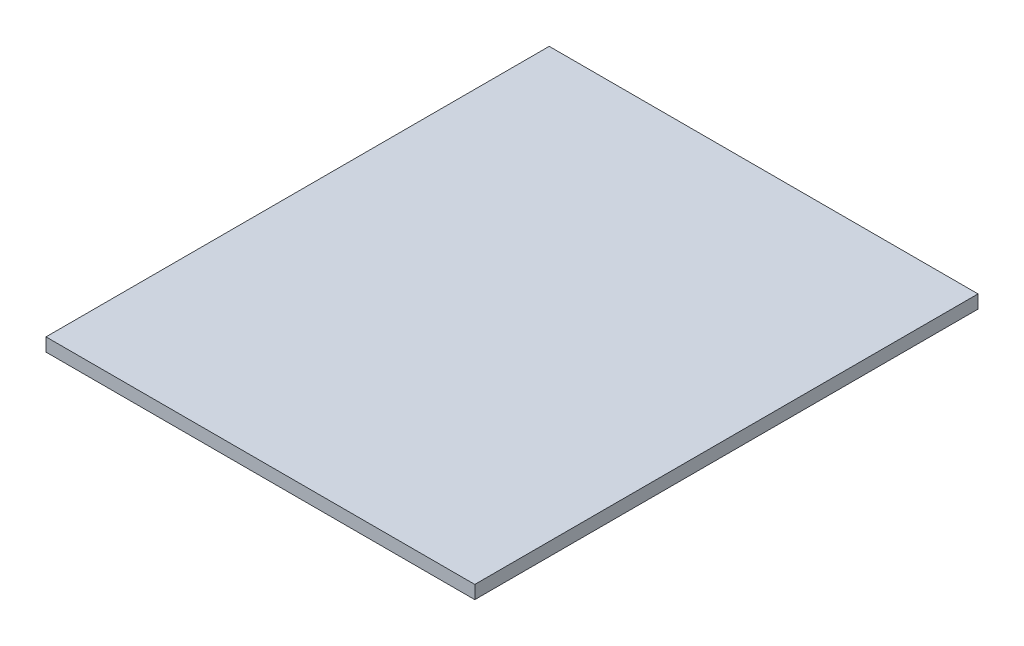
ISO-10303-21;
HEADER;
FILE_DESCRIPTION(('STEP AP214'),'2;1');
FILE_NAME('part.step','',(''),(''),'','','');
FILE_SCHEMA(('AUTOMOTIVE_DESIGN { 1 0 10303 214 1 1 1 1 }'));
ENDSEC;
DATA;
#1=APPLICATION_CONTEXT('core data for automotive mechanical design processes');
#2=APPLICATION_PROTOCOL_DEFINITION('international standard','automotive_design',2000,#1);
#3=PRODUCT_CONTEXT('',#1,'mechanical');
#4=PRODUCT('Part','Part','',(#3));
#5=PRODUCT_RELATED_PRODUCT_CATEGORY('part','',(#4));
#6=PRODUCT_DEFINITION_FORMATION('','',#4);
#7=PRODUCT_DEFINITION_CONTEXT('part definition',#1,'design');
#8=PRODUCT_DEFINITION('design','',#6,#7);
#9=PRODUCT_DEFINITION_SHAPE('','',#8);
#10=(LENGTH_UNIT() NAMED_UNIT(*) SI_UNIT(.MILLI.,.METRE.));
#11=(NAMED_UNIT(*) PLANE_ANGLE_UNIT() SI_UNIT($,.RADIAN.));
#12=(NAMED_UNIT(*) SI_UNIT($,.STERADIAN.) SOLID_ANGLE_UNIT());
#13=UNCERTAINTY_MEASURE_WITH_UNIT(LENGTH_MEASURE(1.E-05),#10,'distance_accuracy_value','');
#14=(GEOMETRIC_REPRESENTATION_CONTEXT(3) GLOBAL_UNCERTAINTY_ASSIGNED_CONTEXT((#13)) GLOBAL_UNIT_ASSIGNED_CONTEXT((#10,
#11,#12)) REPRESENTATION_CONTEXT('',''));
#15=CARTESIAN_POINT('',(0.,0.,0.));
#16=DIRECTION('',(0.,0.,1.));
#17=DIRECTION('',(1.,0.,0.));
#18=AXIS2_PLACEMENT_3D('',#15,#16,#17);
#19=CARTESIAN_POINT('',(31.8,0.98,0.));
#20=DIRECTION('',(0.,0.,-1.));
#21=DIRECTION('',(-1.,0.,0.));
#22=AXIS2_PLACEMENT_3D('',#19,#20,#21);
#23=PLANE('',#22);
#24=DIRECTION('',(1.,0.,0.));
#25=VECTOR('',#24,1.);
#26=CARTESIAN_POINT('',(31.8,0.,0.));
#27=LINE('',#26,#25);
#28=CARTESIAN_POINT('',(0.,0.,0.));
#29=VERTEX_POINT('',#28);
#30=CARTESIAN_POINT('',(31.8,0.,0.));
#31=VERTEX_POINT('',#30);
#32=EDGE_CURVE('E100',#29,#31,#27,.T.);
#33=ORIENTED_EDGE('',*,*,#32,.T.);
#34=DIRECTION('',(0.,-1.,0.));
#35=VECTOR('',#34,1.);
#36=CARTESIAN_POINT('',(31.8,0.98,0.));
#37=LINE('',#36,#35);
#38=CARTESIAN_POINT('',(31.8,0.98,0.));
#39=VERTEX_POINT('',#38);
#40=EDGE_CURVE('E11',#39,#31,#37,.T.);
#41=ORIENTED_EDGE('',*,*,#40,.F.);
#42=DIRECTION('',(1.,0.,0.));
#43=VECTOR('',#42,1.);
#44=CARTESIAN_POINT('',(31.8,0.98,0.));
#45=LINE('',#44,#43);
#46=CARTESIAN_POINT('',(0.,0.98,0.));
#47=VERTEX_POINT('',#46);
#48=EDGE_CURVE('E88',#47,#39,#45,.T.);
#49=ORIENTED_EDGE('',*,*,#48,.F.);
#50=DIRECTION('',(0.,-1.,0.));
#51=VECTOR('',#50,1.);
#52=CARTESIAN_POINT('',(0.,0.98,0.));
#53=LINE('',#52,#51);
#54=EDGE_CURVE('E96',#47,#29,#53,.T.);
#55=ORIENTED_EDGE('',*,*,#54,.T.);
#56=EDGE_LOOP('',(#33,#41,#49,#55));
#57=FACE_BOUND('',#56,.T.);
#58=ADVANCED_FACE('F37',(#57),#23,.F.);
#59=CARTESIAN_POINT('',(31.8,0.98,-37.32));
#60=DIRECTION('',(-1.,0.,0.));
#61=DIRECTION('',(0.,0.,1.));
#62=AXIS2_PLACEMENT_3D('',#59,#60,#61);
#63=PLANE('',#62);
#64=DIRECTION('',(0.,0.,-1.));
#65=VECTOR('',#64,1.);
#66=CARTESIAN_POINT('',(31.8,0.,-37.32));
#67=LINE('',#66,#65);
#68=CARTESIAN_POINT('',(31.8,0.,-37.32));
#69=VERTEX_POINT('',#68);
#70=EDGE_CURVE('E92',#31,#69,#67,.T.);
#71=ORIENTED_EDGE('',*,*,#70,.T.);
#72=DIRECTION('',(0.,-1.,0.));
#73=VECTOR('',#72,1.);
#74=CARTESIAN_POINT('',(31.8,0.98,-37.32));
#75=LINE('',#74,#73);
#76=CARTESIAN_POINT('',(31.8,0.98,-37.32));
#77=VERTEX_POINT('',#76);
#78=EDGE_CURVE('E45',#77,#69,#75,.T.);
#79=ORIENTED_EDGE('',*,*,#78,.F.);
#80=DIRECTION('',(0.,0.,-1.));
#81=VECTOR('',#80,1.);
#82=CARTESIAN_POINT('',(31.8,0.98,-37.32));
#83=LINE('',#82,#81);
#84=EDGE_CURVE('E83',#39,#77,#83,.T.);
#85=ORIENTED_EDGE('',*,*,#84,.F.);
#86=ORIENTED_EDGE('',*,*,#40,.T.);
#87=EDGE_LOOP('',(#71,#79,#85,#86));
#88=FACE_BOUND('',#87,.T.);
#89=ADVANCED_FACE('F91',(#88),#63,.F.);
#90=CARTESIAN_POINT('',(0.,0.98,-37.32));
#91=DIRECTION('',(0.,0.,1.));
#92=DIRECTION('',(1.,0.,0.));
#93=AXIS2_PLACEMENT_3D('',#90,#91,#92);
#94=PLANE('',#93);
#95=DIRECTION('',(-1.,0.,0.));
#96=VECTOR('',#95,1.);
#97=CARTESIAN_POINT('',(0.,0.,-37.32));
#98=LINE('',#97,#96);
#99=CARTESIAN_POINT('',(0.,0.,-37.32));
#100=VERTEX_POINT('',#99);
#101=EDGE_CURVE('E70',#69,#100,#98,.T.);
#102=ORIENTED_EDGE('',*,*,#101,.T.);
#103=DIRECTION('',(0.,-1.,0.));
#104=VECTOR('',#103,1.);
#105=CARTESIAN_POINT('',(0.,0.98,-37.32));
#106=LINE('',#105,#104);
#107=CARTESIAN_POINT('',(0.,0.98,-37.32));
#108=VERTEX_POINT('',#107);
#109=EDGE_CURVE('E93',#108,#100,#106,.T.);
#110=ORIENTED_EDGE('',*,*,#109,.F.);
#111=DIRECTION('',(-1.,0.,0.));
#112=VECTOR('',#111,1.);
#113=CARTESIAN_POINT('',(0.,0.98,-37.32));
#114=LINE('',#113,#112);
#115=EDGE_CURVE('E86',#77,#108,#114,.T.);
#116=ORIENTED_EDGE('',*,*,#115,.F.);
#117=ORIENTED_EDGE('',*,*,#78,.T.);
#118=EDGE_LOOP('',(#102,#110,#116,#117));
#119=FACE_BOUND('',#118,.T.);
#120=ADVANCED_FACE('F94',(#119),#94,.F.);
#121=CARTESIAN_POINT('',(0.,0.98,0.));
#122=DIRECTION('',(1.,0.,0.));
#123=DIRECTION('',(0.,0.,-1.));
#124=AXIS2_PLACEMENT_3D('',#121,#122,#123);
#125=PLANE('',#124);
#126=DIRECTION('',(0.,0.,1.));
#127=VECTOR('',#126,1.);
#128=CARTESIAN_POINT('',(0.,0.,0.));
#129=LINE('',#128,#127);
#130=EDGE_CURVE('E76',#100,#29,#129,.T.);
#131=ORIENTED_EDGE('',*,*,#130,.T.);
#132=ORIENTED_EDGE('',*,*,#54,.F.);
#133=DIRECTION('',(0.,0.,1.));
#134=VECTOR('',#133,1.);
#135=CARTESIAN_POINT('',(0.,0.98,0.));
#136=LINE('',#135,#134);
#137=EDGE_CURVE('E53',#108,#47,#136,.T.);
#138=ORIENTED_EDGE('',*,*,#137,.F.);
#139=ORIENTED_EDGE('',*,*,#109,.T.);
#140=EDGE_LOOP('',(#131,#132,#138,#139));
#141=FACE_BOUND('',#140,.T.);
#142=ADVANCED_FACE('F107',(#141),#125,.F.);
#143=CARTESIAN_POINT('',(0.,0.98,0.));
#144=DIRECTION('',(0.,-1.,0.));
#145=DIRECTION('',(0.,0.,-1.));
#146=AXIS2_PLACEMENT_3D('',#143,#144,#145);
#147=PLANE('',#146);
#148=ORIENTED_EDGE('',*,*,#48,.T.);
#149=ORIENTED_EDGE('',*,*,#84,.T.);
#150=ORIENTED_EDGE('',*,*,#115,.T.);
#151=ORIENTED_EDGE('',*,*,#137,.T.);
#152=EDGE_LOOP('',(#148,#149,#150,#151));
#153=FACE_BOUND('',#152,.T.);
#154=ADVANCED_FACE('F84',(#153),#147,.F.);
#155=CARTESIAN_POINT('',(0.,0.,0.));
#156=DIRECTION('',(0.,-1.,0.));
#157=DIRECTION('',(0.,0.,-1.));
#158=AXIS2_PLACEMENT_3D('',#155,#156,#157);
#159=PLANE('',#158);
#160=ORIENTED_EDGE('',*,*,#32,.F.);
#161=ORIENTED_EDGE('',*,*,#130,.F.);
#162=ORIENTED_EDGE('',*,*,#101,.F.);
#163=ORIENTED_EDGE('',*,*,#70,.F.);
#164=EDGE_LOOP('',(#160,#161,#162,#163));
#165=FACE_BOUND('',#164,.T.);
#166=ADVANCED_FACE('F110',(#165),#159,.T.);
#167=CLOSED_SHELL('',(#58,#89,#120,#142,#154,#166));
#168=MANIFOLD_SOLID_BREP('B2',#167);
#169=ADVANCED_BREP_SHAPE_REPRESENTATION('',(#18,#168),#14);
#170=SHAPE_DEFINITION_REPRESENTATION(#9,#169);
ENDSEC;
END-ISO-10303-21;
